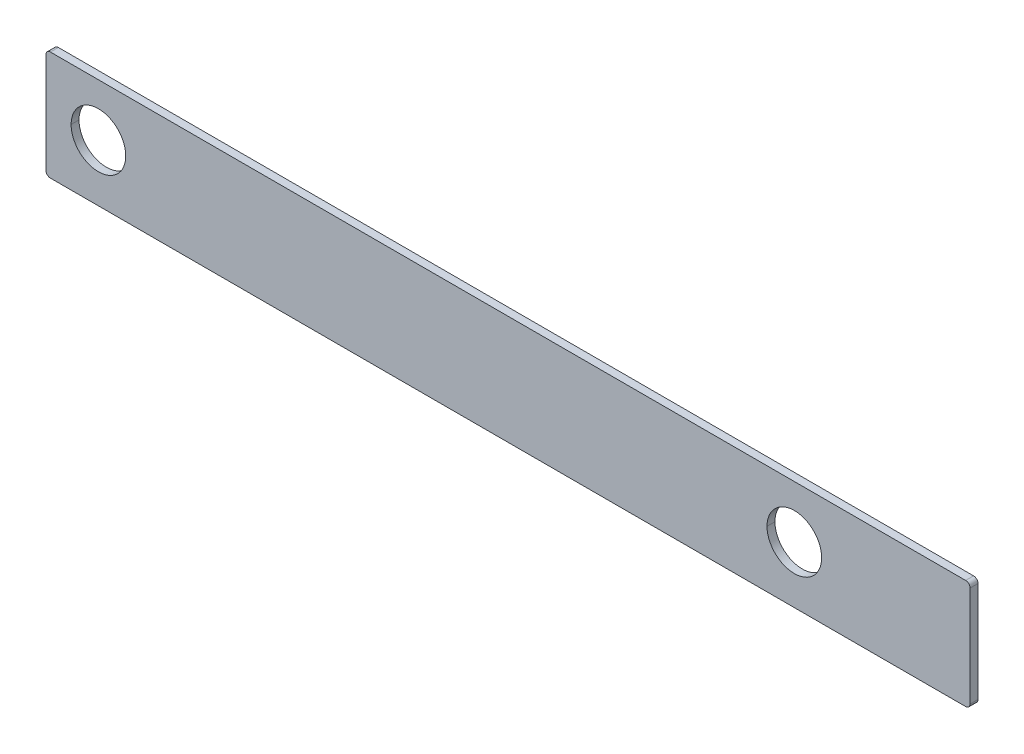
ISO-10303-21;
HEADER;
FILE_DESCRIPTION(('STEP AP214'),'2;1');
FILE_NAME('part.step','',(''),(''),'','','');
FILE_SCHEMA(('AUTOMOTIVE_DESIGN { 1 0 10303 214 1 1 1 1 }'));
ENDSEC;
DATA;
#1=APPLICATION_CONTEXT('core data for automotive mechanical design processes');
#2=APPLICATION_PROTOCOL_DEFINITION('international standard','automotive_design',2000,#1);
#3=PRODUCT_CONTEXT('',#1,'mechanical');
#4=PRODUCT('Part','Part','',(#3));
#5=PRODUCT_RELATED_PRODUCT_CATEGORY('part','',(#4));
#6=PRODUCT_DEFINITION_FORMATION('','',#4);
#7=PRODUCT_DEFINITION_CONTEXT('part definition',#1,'design');
#8=PRODUCT_DEFINITION('design','',#6,#7);
#9=PRODUCT_DEFINITION_SHAPE('','',#8);
#10=(LENGTH_UNIT() NAMED_UNIT(*) SI_UNIT(.MILLI.,.METRE.));
#11=(NAMED_UNIT(*) PLANE_ANGLE_UNIT() SI_UNIT($,.RADIAN.));
#12=(NAMED_UNIT(*) SI_UNIT($,.STERADIAN.) SOLID_ANGLE_UNIT());
#13=UNCERTAINTY_MEASURE_WITH_UNIT(LENGTH_MEASURE(1.E-05),#10,'distance_accuracy_value','');
#14=(GEOMETRIC_REPRESENTATION_CONTEXT(3) GLOBAL_UNCERTAINTY_ASSIGNED_CONTEXT((#13)) GLOBAL_UNIT_ASSIGNED_CONTEXT((#10,
#11,#12)) REPRESENTATION_CONTEXT('',''));
#15=CARTESIAN_POINT('',(0.,0.,0.));
#16=DIRECTION('',(0.,0.,1.));
#17=DIRECTION('',(1.,0.,0.));
#18=AXIS2_PLACEMENT_3D('',#15,#16,#17);
#19=CARTESIAN_POINT('',(52.45,-6.2,0.));
#20=DIRECTION('',(1.,0.,0.));
#21=DIRECTION('',(0.,1.,0.));
#22=AXIS2_PLACEMENT_3D('',#19,#20,#21);
#23=PLANE('',#22);
#24=DIRECTION('',(0.,1.,0.));
#25=VECTOR('',#24,1.);
#26=CARTESIAN_POINT('',(52.45,-5.7,0.));
#27=LINE('',#26,#25);
#28=CARTESIAN_POINT('',(52.45,-5.7,0.));
#29=VERTEX_POINT('',#28);
#30=CARTESIAN_POINT('',(52.45,5.7,0.));
#31=VERTEX_POINT('',#30);
#32=EDGE_CURVE('E141',#29,#31,#27,.T.);
#33=ORIENTED_EDGE('',*,*,#32,.T.);
#34=DIRECTION('',(0.,0.,-1.));
#35=VECTOR('',#34,1.);
#36=CARTESIAN_POINT('',(52.45,5.7,0.9));
#37=LINE('',#36,#35);
#38=CARTESIAN_POINT('',(52.45,5.7,0.9));
#39=VERTEX_POINT('',#38);
#40=EDGE_CURVE('E11',#39,#31,#37,.T.);
#41=ORIENTED_EDGE('',*,*,#40,.F.);
#42=DIRECTION('',(0.,1.,0.));
#43=VECTOR('',#42,1.);
#44=CARTESIAN_POINT('',(52.45,-5.7,0.9));
#45=LINE('',#44,#43);
#46=CARTESIAN_POINT('',(52.45,-5.7,0.9));
#47=VERTEX_POINT('',#46);
#48=EDGE_CURVE('E139',#47,#39,#45,.T.);
#49=ORIENTED_EDGE('',*,*,#48,.F.);
#50=DIRECTION('',(0.,0.,-1.));
#51=VECTOR('',#50,1.);
#52=CARTESIAN_POINT('',(52.45,-5.7,0.9));
#53=LINE('',#52,#51);
#54=EDGE_CURVE('E235',#47,#29,#53,.T.);
#55=ORIENTED_EDGE('',*,*,#54,.T.);
#56=EDGE_LOOP('',(#33,#41,#49,#55));
#57=FACE_BOUND('',#56,.T.);
#58=ADVANCED_FACE('F17',(#57),#23,.T.);
#59=CARTESIAN_POINT('',(51.95,5.7,2.07324));
#60=DIRECTION('',(0.,0.,-1.));
#61=DIRECTION('',(0.,1.,0.));
#62=AXIS2_PLACEMENT_3D('',#59,#60,#61);
#63=CYLINDRICAL_SURFACE('',#62,0.5);
#64=DIRECTION('',(0.,0.,-1.));
#65=VECTOR('',#64,1.);
#66=CARTESIAN_POINT('',(51.95,6.2,0.9));
#67=LINE('',#66,#65);
#68=CARTESIAN_POINT('',(51.95,6.2,0.9));
#69=VERTEX_POINT('',#68);
#70=CARTESIAN_POINT('',(51.95,6.2,0.));
#71=VERTEX_POINT('',#70);
#72=EDGE_CURVE('E26',#69,#71,#67,.T.);
#73=ORIENTED_EDGE('',*,*,#72,.F.);
#74=CARTESIAN_POINT('',(51.95,5.7,0.9));
#75=DIRECTION('',(0.,0.,1.));
#76=DIRECTION('',(1.,0.,0.));
#77=AXIS2_PLACEMENT_3D('',#74,#75,#76);
#78=CIRCLE('',#77,0.5);
#79=EDGE_CURVE('E146',#39,#69,#78,.T.);
#80=ORIENTED_EDGE('',*,*,#79,.F.);
#81=ORIENTED_EDGE('',*,*,#40,.T.);
#82=CARTESIAN_POINT('',(51.95,5.7,0.));
#83=DIRECTION('',(0.,0.,-1.));
#84=DIRECTION('',(0.,1.,0.));
#85=AXIS2_PLACEMENT_3D('',#82,#83,#84);
#86=CIRCLE('',#85,0.5);
#87=EDGE_CURVE('E176',#71,#31,#86,.T.);
#88=ORIENTED_EDGE('',*,*,#87,.F.);
#89=EDGE_LOOP('',(#73,#80,#81,#88));
#90=FACE_BOUND('',#89,.T.);
#91=ADVANCED_FACE('F147',(#90),#63,.T.);
#92=CARTESIAN_POINT('',(52.45,6.2,0.));
#93=DIRECTION('',(0.,1.,0.));
#94=DIRECTION('',(1.,0.,0.));
#95=AXIS2_PLACEMENT_3D('',#92,#93,#94);
#96=PLANE('',#95);
#97=DIRECTION('',(-1.,0.,0.));
#98=VECTOR('',#97,1.);
#99=CARTESIAN_POINT('',(51.95,6.2,0.));
#100=LINE('',#99,#98);
#101=CARTESIAN_POINT('',(-51.95,6.2,0.));
#102=VERTEX_POINT('',#101);
#103=EDGE_CURVE('E173',#71,#102,#100,.T.);
#104=ORIENTED_EDGE('',*,*,#103,.T.);
#105=DIRECTION('',(0.,0.,-1.));
#106=VECTOR('',#105,1.);
#107=CARTESIAN_POINT('',(-51.95,6.2,0.9));
#108=LINE('',#107,#106);
#109=CARTESIAN_POINT('',(-51.95,6.2,0.9));
#110=VERTEX_POINT('',#109);
#111=EDGE_CURVE('E249',#110,#102,#108,.T.);
#112=ORIENTED_EDGE('',*,*,#111,.F.);
#113=DIRECTION('',(-1.,0.,0.));
#114=VECTOR('',#113,1.);
#115=CARTESIAN_POINT('',(51.95,6.2,0.9));
#116=LINE('',#115,#114);
#117=EDGE_CURVE('E152',#69,#110,#116,.T.);
#118=ORIENTED_EDGE('',*,*,#117,.F.);
#119=ORIENTED_EDGE('',*,*,#72,.T.);
#120=EDGE_LOOP('',(#104,#112,#118,#119));
#121=FACE_BOUND('',#120,.T.);
#122=ADVANCED_FACE('F260',(#121),#96,.T.);
#123=CARTESIAN_POINT('',(-51.95,5.7,2.07324));
#124=DIRECTION('',(0.,0.,-1.));
#125=DIRECTION('',(-1.,0.,0.));
#126=AXIS2_PLACEMENT_3D('',#123,#124,#125);
#127=CYLINDRICAL_SURFACE('',#126,0.5);
#128=DIRECTION('',(0.,0.,-1.));
#129=VECTOR('',#128,1.);
#130=CARTESIAN_POINT('',(-52.45,5.7,0.9));
#131=LINE('',#130,#129);
#132=CARTESIAN_POINT('',(-52.45,5.7,0.9));
#133=VERTEX_POINT('',#132);
#134=CARTESIAN_POINT('',(-52.45,5.7,0.));
#135=VERTEX_POINT('',#134);
#136=EDGE_CURVE('E247',#133,#135,#131,.T.);
#137=ORIENTED_EDGE('',*,*,#136,.F.);
#138=CARTESIAN_POINT('',(-51.95,5.7,0.9));
#139=DIRECTION('',(0.,0.,1.));
#140=DIRECTION('',(0.,1.,0.));
#141=AXIS2_PLACEMENT_3D('',#138,#139,#140);
#142=CIRCLE('',#141,0.5);
#143=EDGE_CURVE('E209',#110,#133,#142,.T.);
#144=ORIENTED_EDGE('',*,*,#143,.F.);
#145=ORIENTED_EDGE('',*,*,#111,.T.);
#146=CARTESIAN_POINT('',(-51.95,5.7,0.));
#147=DIRECTION('',(0.,0.,-1.));
#148=DIRECTION('',(-1.,0.,0.));
#149=AXIS2_PLACEMENT_3D('',#146,#147,#148);
#150=CIRCLE('',#149,0.5);
#151=EDGE_CURVE('E177',#135,#102,#150,.T.);
#152=ORIENTED_EDGE('',*,*,#151,.F.);
#153=EDGE_LOOP('',(#137,#144,#145,#152));
#154=FACE_BOUND('',#153,.T.);
#155=ADVANCED_FACE('F303',(#154),#127,.T.);
#156=CARTESIAN_POINT('',(-52.45,6.2,0.));
#157=DIRECTION('',(-1.,0.,0.));
#158=DIRECTION('',(0.,0.,1.));
#159=AXIS2_PLACEMENT_3D('',#156,#157,#158);
#160=PLANE('',#159);
#161=DIRECTION('',(0.,-1.,0.));
#162=VECTOR('',#161,1.);
#163=CARTESIAN_POINT('',(-52.45,5.7,0.9));
#164=LINE('',#163,#162);
#165=CARTESIAN_POINT('',(-52.45,-5.7,0.9));
#166=VERTEX_POINT('',#165);
#167=EDGE_CURVE('E204',#133,#166,#164,.T.);
#168=ORIENTED_EDGE('',*,*,#167,.F.);
#169=ORIENTED_EDGE('',*,*,#136,.T.);
#170=DIRECTION('',(0.,-1.,0.));
#171=VECTOR('',#170,1.);
#172=CARTESIAN_POINT('',(-52.45,5.7,0.));
#173=LINE('',#172,#171);
#174=CARTESIAN_POINT('',(-52.45,-5.7,0.));
#175=VERTEX_POINT('',#174);
#176=EDGE_CURVE('E271',#135,#175,#173,.T.);
#177=ORIENTED_EDGE('',*,*,#176,.T.);
#178=DIRECTION('',(0.,0.,-1.));
#179=VECTOR('',#178,1.);
#180=CARTESIAN_POINT('',(-52.45,-5.7,0.9));
#181=LINE('',#180,#179);
#182=EDGE_CURVE('E244',#166,#175,#181,.T.);
#183=ORIENTED_EDGE('',*,*,#182,.F.);
#184=EDGE_LOOP('',(#168,#169,#177,#183));
#185=FACE_BOUND('',#184,.T.);
#186=ADVANCED_FACE('F302',(#185),#160,.T.);
#187=CARTESIAN_POINT('',(-51.95,-5.7,2.07324));
#188=DIRECTION('',(0.,0.,-1.));
#189=DIRECTION('',(0.,-1.,0.));
#190=AXIS2_PLACEMENT_3D('',#187,#188,#189);
#191=CYLINDRICAL_SURFACE('',#190,0.5);
#192=DIRECTION('',(0.,0.,-1.));
#193=VECTOR('',#192,1.);
#194=CARTESIAN_POINT('',(-51.95,-6.2,0.9));
#195=LINE('',#194,#193);
#196=CARTESIAN_POINT('',(-51.95,-6.2,0.9));
#197=VERTEX_POINT('',#196);
#198=CARTESIAN_POINT('',(-51.95,-6.2,0.));
#199=VERTEX_POINT('',#198);
#200=EDGE_CURVE('E241',#197,#199,#195,.T.);
#201=ORIENTED_EDGE('',*,*,#200,.F.);
#202=CARTESIAN_POINT('',(-51.95,-5.7,0.9));
#203=DIRECTION('',(0.,0.,1.));
#204=DIRECTION('',(-1.,0.,0.));
#205=AXIS2_PLACEMENT_3D('',#202,#203,#204);
#206=CIRCLE('',#205,0.5);
#207=EDGE_CURVE('E208',#166,#197,#206,.T.);
#208=ORIENTED_EDGE('',*,*,#207,.F.);
#209=ORIENTED_EDGE('',*,*,#182,.T.);
#210=CARTESIAN_POINT('',(-51.95,-5.7,0.));
#211=DIRECTION('',(0.,0.,-1.));
#212=DIRECTION('',(0.,-1.,0.));
#213=AXIS2_PLACEMENT_3D('',#210,#211,#212);
#214=CIRCLE('',#213,0.5);
#215=EDGE_CURVE('E277',#199,#175,#214,.T.);
#216=ORIENTED_EDGE('',*,*,#215,.F.);
#217=EDGE_LOOP('',(#201,#208,#209,#216));
#218=FACE_BOUND('',#217,.T.);
#219=ADVANCED_FACE('F298',(#218),#191,.T.);
#220=CARTESIAN_POINT('',(-52.45,-6.2,0.));
#221=DIRECTION('',(0.,-1.,0.));
#222=DIRECTION('',(0.,0.,-1.));
#223=AXIS2_PLACEMENT_3D('',#220,#221,#222);
#224=PLANE('',#223);
#225=DIRECTION('',(1.,0.,0.));
#226=VECTOR('',#225,1.);
#227=CARTESIAN_POINT('',(-51.95,-6.2,0.9));
#228=LINE('',#227,#226);
#229=CARTESIAN_POINT('',(51.95,-6.2,0.9));
#230=VERTEX_POINT('',#229);
#231=EDGE_CURVE('E224',#197,#230,#228,.T.);
#232=ORIENTED_EDGE('',*,*,#231,.F.);
#233=ORIENTED_EDGE('',*,*,#200,.T.);
#234=DIRECTION('',(1.,0.,0.));
#235=VECTOR('',#234,1.);
#236=CARTESIAN_POINT('',(-51.95,-6.2,0.));
#237=LINE('',#236,#235);
#238=CARTESIAN_POINT('',(51.95,-6.2,0.));
#239=VERTEX_POINT('',#238);
#240=EDGE_CURVE('E284',#199,#239,#237,.T.);
#241=ORIENTED_EDGE('',*,*,#240,.T.);
#242=DIRECTION('',(0.,0.,-1.));
#243=VECTOR('',#242,1.);
#244=CARTESIAN_POINT('',(51.95,-6.2,0.9));
#245=LINE('',#244,#243);
#246=EDGE_CURVE('E238',#230,#239,#245,.T.);
#247=ORIENTED_EDGE('',*,*,#246,.F.);
#248=EDGE_LOOP('',(#232,#233,#241,#247));
#249=FACE_BOUND('',#248,.T.);
#250=ADVANCED_FACE('F19',(#249),#224,.T.);
#251=CARTESIAN_POINT('',(51.95,-5.7,2.07324));
#252=DIRECTION('',(0.,0.,-1.));
#253=DIRECTION('',(1.,0.,0.));
#254=AXIS2_PLACEMENT_3D('',#251,#252,#253);
#255=CYLINDRICAL_SURFACE('',#254,0.5);
#256=ORIENTED_EDGE('',*,*,#54,.F.);
#257=CARTESIAN_POINT('',(51.95,-5.7,0.9));
#258=DIRECTION('',(0.,0.,1.));
#259=DIRECTION('',(0.,-1.,0.));
#260=AXIS2_PLACEMENT_3D('',#257,#258,#259);
#261=CIRCLE('',#260,0.5);
#262=EDGE_CURVE('E158',#230,#47,#261,.T.);
#263=ORIENTED_EDGE('',*,*,#262,.F.);
#264=ORIENTED_EDGE('',*,*,#246,.T.);
#265=CARTESIAN_POINT('',(51.95,-5.7,0.));
#266=DIRECTION('',(0.,0.,-1.));
#267=DIRECTION('',(1.,0.,0.));
#268=AXIS2_PLACEMENT_3D('',#265,#266,#267);
#269=CIRCLE('',#268,0.5);
#270=EDGE_CURVE('E180',#29,#239,#269,.T.);
#271=ORIENTED_EDGE('',*,*,#270,.F.);
#272=EDGE_LOOP('',(#256,#263,#264,#271));
#273=FACE_BOUND('',#272,.T.);
#274=ADVANCED_FACE('F328',(#273),#255,.T.);
#275=CARTESIAN_POINT('',(32.5,0.25,0.9));
#276=DIRECTION('',(0.,0.,1.));
#277=DIRECTION('',(1.,0.,0.));
#278=AXIS2_PLACEMENT_3D('',#275,#276,#277);
#279=CYLINDRICAL_SURFACE('',#278,3.1);
#280=DIRECTION('',(0.,0.,-1.));
#281=VECTOR('',#280,1.);
#282=CARTESIAN_POINT('',(29.4,0.25,0.9));
#283=LINE('',#282,#281);
#284=CARTESIAN_POINT('',(29.4,0.25,0.9));
#285=VERTEX_POINT('',#284);
#286=CARTESIAN_POINT('',(29.4,0.25,0.));
#287=VERTEX_POINT('',#286);
#288=EDGE_CURVE('E48',#285,#287,#283,.T.);
#289=ORIENTED_EDGE('',*,*,#288,.F.);
#290=CARTESIAN_POINT('',(32.5,0.25,0.9));
#291=DIRECTION('',(0.,0.,1.));
#292=DIRECTION('',(-1.,0.,0.));
#293=AXIS2_PLACEMENT_3D('',#290,#291,#292);
#294=CIRCLE('',#293,3.1);
#295=CARTESIAN_POINT('',(35.6,0.25,0.9));
#296=VERTEX_POINT('',#295);
#297=EDGE_CURVE('E214',#285,#296,#294,.T.);
#298=ORIENTED_EDGE('',*,*,#297,.T.);
#299=DIRECTION('',(0.,0.,-1.));
#300=VECTOR('',#299,1.);
#301=CARTESIAN_POINT('',(35.6,0.25,0.9));
#302=LINE('',#301,#300);
#303=CARTESIAN_POINT('',(35.6,0.25,0.));
#304=VERTEX_POINT('',#303);
#305=EDGE_CURVE('E38',#296,#304,#302,.T.);
#306=ORIENTED_EDGE('',*,*,#305,.T.);
#307=CARTESIAN_POINT('',(32.5,0.25,0.));
#308=DIRECTION('',(0.,0.,1.));
#309=DIRECTION('',(-1.,0.,0.));
#310=AXIS2_PLACEMENT_3D('',#307,#308,#309);
#311=CIRCLE('',#310,3.1);
#312=EDGE_CURVE('E181',#287,#304,#311,.T.);
#313=ORIENTED_EDGE('',*,*,#312,.F.);
#314=EDGE_LOOP('',(#289,#298,#306,#313));
#315=FACE_BOUND('',#314,.T.);
#316=ADVANCED_FACE('F324',(#315),#279,.F.);
#317=CARTESIAN_POINT('',(32.5,0.25,0.9));
#318=DIRECTION('',(0.,0.,1.));
#319=DIRECTION('',(1.,0.,0.));
#320=AXIS2_PLACEMENT_3D('',#317,#318,#319);
#321=CYLINDRICAL_SURFACE('',#320,3.1);
#322=ORIENTED_EDGE('',*,*,#305,.F.);
#323=CARTESIAN_POINT('',(32.5,0.25,0.9));
#324=DIRECTION('',(0.,0.,1.));
#325=DIRECTION('',(1.,0.,0.));
#326=AXIS2_PLACEMENT_3D('',#323,#324,#325);
#327=CIRCLE('',#326,3.1);
#328=EDGE_CURVE('E217',#296,#285,#327,.T.);
#329=ORIENTED_EDGE('',*,*,#328,.T.);
#330=ORIENTED_EDGE('',*,*,#288,.T.);
#331=CARTESIAN_POINT('',(32.5,0.25,0.));
#332=DIRECTION('',(0.,0.,1.));
#333=DIRECTION('',(1.,0.,0.));
#334=AXIS2_PLACEMENT_3D('',#331,#332,#333);
#335=CIRCLE('',#334,3.1);
#336=EDGE_CURVE('E185',#304,#287,#335,.T.);
#337=ORIENTED_EDGE('',*,*,#336,.F.);
#338=EDGE_LOOP('',(#322,#329,#330,#337));
#339=FACE_BOUND('',#338,.T.);
#340=ADVANCED_FACE('F327',(#339),#321,.F.);
#341=CARTESIAN_POINT('',(0.,0.,0.9));
#342=DIRECTION('',(0.,0.,1.));
#343=DIRECTION('',(1.,0.,0.));
#344=AXIS2_PLACEMENT_3D('',#341,#342,#343);
#345=PLANE('',#344);
#346=CARTESIAN_POINT('',(-46.5,0.25,0.9));
#347=DIRECTION('',(0.,0.,1.));
#348=DIRECTION('',(-1.,0.,0.));
#349=AXIS2_PLACEMENT_3D('',#346,#347,#348);
#350=CIRCLE('',#349,3.1);
#351=CARTESIAN_POINT('',(-49.6,0.25,0.9));
#352=VERTEX_POINT('',#351);
#353=CARTESIAN_POINT('',(-43.4,0.25,0.9));
#354=VERTEX_POINT('',#353);
#355=EDGE_CURVE('E160',#352,#354,#350,.T.);
#356=ORIENTED_EDGE('',*,*,#355,.F.);
#357=CARTESIAN_POINT('',(-46.5,0.25,0.9));
#358=DIRECTION('',(0.,0.,1.));
#359=DIRECTION('',(1.,0.,0.));
#360=AXIS2_PLACEMENT_3D('',#357,#358,#359);
#361=CIRCLE('',#360,3.1);
#362=EDGE_CURVE('E186',#354,#352,#361,.T.);
#363=ORIENTED_EDGE('',*,*,#362,.F.);
#364=EDGE_LOOP('',(#356,#363));
#365=FACE_BOUND('',#364,.T.);
#366=ORIENTED_EDGE('',*,*,#297,.F.);
#367=ORIENTED_EDGE('',*,*,#328,.F.);
#368=EDGE_LOOP('',(#366,#367));
#369=FACE_BOUND('',#368,.T.);
#370=ORIENTED_EDGE('',*,*,#48,.T.);
#371=ORIENTED_EDGE('',*,*,#79,.T.);
#372=ORIENTED_EDGE('',*,*,#117,.T.);
#373=ORIENTED_EDGE('',*,*,#143,.T.);
#374=ORIENTED_EDGE('',*,*,#167,.T.);
#375=ORIENTED_EDGE('',*,*,#207,.T.);
#376=ORIENTED_EDGE('',*,*,#231,.T.);
#377=ORIENTED_EDGE('',*,*,#262,.T.);
#378=EDGE_LOOP('',(#370,#371,#372,#373,#374,#375,#376,#377));
#379=FACE_BOUND('',#378,.T.);
#380=ADVANCED_FACE('F155',(#365,#369,#379),#345,.T.);
#381=CARTESIAN_POINT('',(-46.5,0.25,0.9));
#382=DIRECTION('',(0.,0.,1.));
#383=DIRECTION('',(1.,0.,0.));
#384=AXIS2_PLACEMENT_3D('',#381,#382,#383);
#385=CYLINDRICAL_SURFACE('',#384,3.1);
#386=DIRECTION('',(0.,0.,-1.));
#387=VECTOR('',#386,1.);
#388=CARTESIAN_POINT('',(-49.6,0.25,0.9));
#389=LINE('',#388,#387);
#390=CARTESIAN_POINT('',(-49.6,0.25,0.));
#391=VERTEX_POINT('',#390);
#392=EDGE_CURVE('E168',#352,#391,#389,.T.);
#393=ORIENTED_EDGE('',*,*,#392,.F.);
#394=ORIENTED_EDGE('',*,*,#355,.T.);
#395=DIRECTION('',(0.,0.,-1.));
#396=VECTOR('',#395,1.);
#397=CARTESIAN_POINT('',(-43.4,0.25,0.9));
#398=LINE('',#397,#396);
#399=CARTESIAN_POINT('',(-43.4,0.25,0.));
#400=VERTEX_POINT('',#399);
#401=EDGE_CURVE('E190',#354,#400,#398,.T.);
#402=ORIENTED_EDGE('',*,*,#401,.T.);
#403=CARTESIAN_POINT('',(-46.5,0.25,0.));
#404=DIRECTION('',(0.,0.,1.));
#405=DIRECTION('',(-1.,0.,0.));
#406=AXIS2_PLACEMENT_3D('',#403,#404,#405);
#407=CIRCLE('',#406,3.1);
#408=EDGE_CURVE('E194',#391,#400,#407,.T.);
#409=ORIENTED_EDGE('',*,*,#408,.F.);
#410=EDGE_LOOP('',(#393,#394,#402,#409));
#411=FACE_BOUND('',#410,.T.);
#412=ADVANCED_FACE('F332',(#411),#385,.F.);
#413=CARTESIAN_POINT('',(-46.5,0.25,0.9));
#414=DIRECTION('',(0.,0.,1.));
#415=DIRECTION('',(1.,0.,0.));
#416=AXIS2_PLACEMENT_3D('',#413,#414,#415);
#417=CYLINDRICAL_SURFACE('',#416,3.1);
#418=ORIENTED_EDGE('',*,*,#401,.F.);
#419=ORIENTED_EDGE('',*,*,#362,.T.);
#420=ORIENTED_EDGE('',*,*,#392,.T.);
#421=CARTESIAN_POINT('',(-46.5,0.25,0.));
#422=DIRECTION('',(0.,0.,1.));
#423=DIRECTION('',(1.,0.,0.));
#424=AXIS2_PLACEMENT_3D('',#421,#422,#423);
#425=CIRCLE('',#424,3.1);
#426=EDGE_CURVE('E197',#400,#391,#425,.T.);
#427=ORIENTED_EDGE('',*,*,#426,.F.);
#428=EDGE_LOOP('',(#418,#419,#420,#427));
#429=FACE_BOUND('',#428,.T.);
#430=ADVANCED_FACE('F329',(#429),#417,.F.);
#431=CARTESIAN_POINT('',(0.,0.,0.));
#432=DIRECTION('',(0.,0.,1.));
#433=DIRECTION('',(1.,0.,0.));
#434=AXIS2_PLACEMENT_3D('',#431,#432,#433);
#435=PLANE('',#434);
#436=ORIENTED_EDGE('',*,*,#408,.T.);
#437=ORIENTED_EDGE('',*,*,#426,.T.);
#438=EDGE_LOOP('',(#436,#437));
#439=FACE_BOUND('',#438,.T.);
#440=ORIENTED_EDGE('',*,*,#312,.T.);
#441=ORIENTED_EDGE('',*,*,#336,.T.);
#442=EDGE_LOOP('',(#440,#441));
#443=FACE_BOUND('',#442,.T.);
#444=ORIENTED_EDGE('',*,*,#240,.F.);
#445=ORIENTED_EDGE('',*,*,#215,.T.);
#446=ORIENTED_EDGE('',*,*,#176,.F.);
#447=ORIENTED_EDGE('',*,*,#151,.T.);
#448=ORIENTED_EDGE('',*,*,#103,.F.);
#449=ORIENTED_EDGE('',*,*,#87,.T.);
#450=ORIENTED_EDGE('',*,*,#32,.F.);
#451=ORIENTED_EDGE('',*,*,#270,.T.);
#452=EDGE_LOOP('',(#444,#445,#446,#447,#448,#449,#450,#451));
#453=FACE_BOUND('',#452,.T.);
#454=ADVANCED_FACE('F267',(#439,#443,#453),#435,.F.);
#455=CLOSED_SHELL('',(#58,#91,#122,#155,#186,#219,#250,#274,#316,#340,#380,#412,#430,#454));
#456=MANIFOLD_SOLID_BREP('B1',#455);
#457=ADVANCED_BREP_SHAPE_REPRESENTATION('',(#18,#456),#14);
#458=SHAPE_DEFINITION_REPRESENTATION(#9,#457);
ENDSEC;
END-ISO-10303-21;
